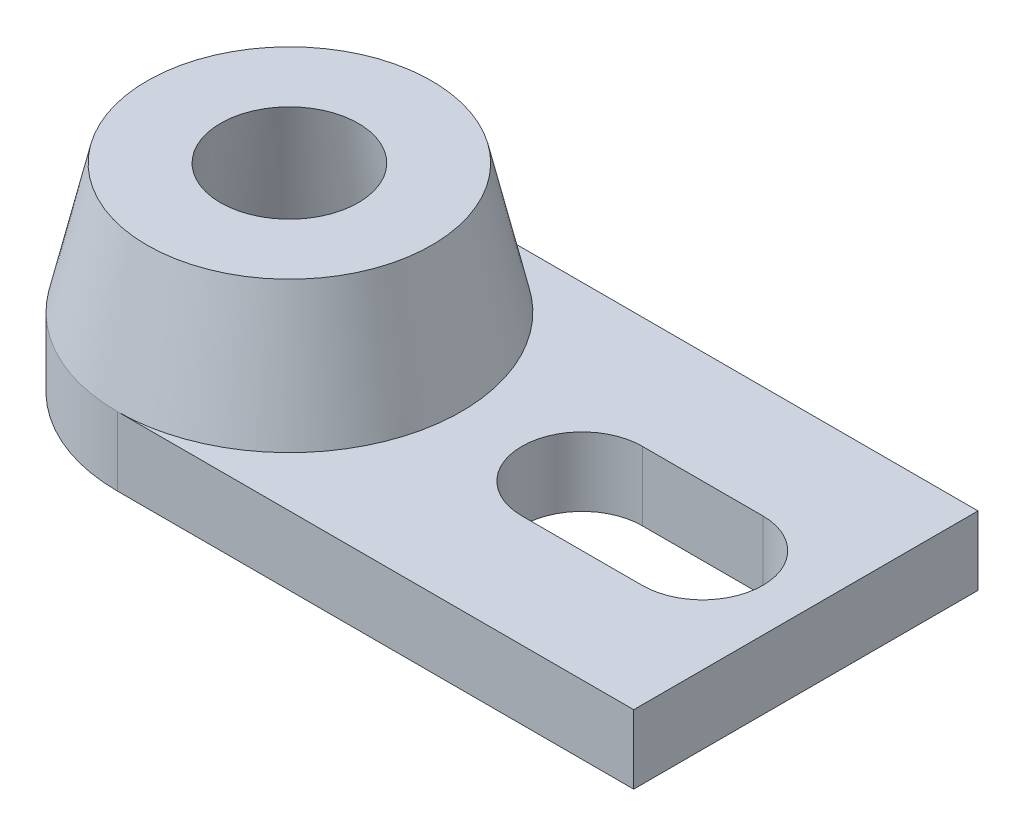
ISO-10303-21;
HEADER;
FILE_DESCRIPTION(('STEP AP214'),'2;1');
FILE_NAME('part.step','',(''),(''),'','','');
FILE_SCHEMA(('AUTOMOTIVE_DESIGN { 1 0 10303 214 1 1 1 1 }'));
ENDSEC;
DATA;
#1=APPLICATION_CONTEXT('core data for automotive mechanical design processes');
#2=APPLICATION_PROTOCOL_DEFINITION('international standard','automotive_design',2000,#1);
#3=PRODUCT_CONTEXT('',#1,'mechanical');
#4=PRODUCT('Part','Part','',(#3));
#5=PRODUCT_RELATED_PRODUCT_CATEGORY('part','',(#4));
#6=PRODUCT_DEFINITION_FORMATION('','',#4);
#7=PRODUCT_DEFINITION_CONTEXT('part definition',#1,'design');
#8=PRODUCT_DEFINITION('design','',#6,#7);
#9=PRODUCT_DEFINITION_SHAPE('','',#8);
#10=(LENGTH_UNIT() NAMED_UNIT(*) SI_UNIT(.MILLI.,.METRE.));
#11=(NAMED_UNIT(*) PLANE_ANGLE_UNIT() SI_UNIT($,.RADIAN.));
#12=(NAMED_UNIT(*) SI_UNIT($,.STERADIAN.) SOLID_ANGLE_UNIT());
#13=UNCERTAINTY_MEASURE_WITH_UNIT(LENGTH_MEASURE(1.E-05),#10,'distance_accuracy_value','');
#14=(GEOMETRIC_REPRESENTATION_CONTEXT(3) GLOBAL_UNCERTAINTY_ASSIGNED_CONTEXT((#13)) GLOBAL_UNIT_ASSIGNED_CONTEXT((#10,
#11,#12)) REPRESENTATION_CONTEXT('',''));
#15=CARTESIAN_POINT('',(0.,0.,0.));
#16=DIRECTION('',(0.,0.,1.));
#17=DIRECTION('',(1.,0.,0.));
#18=AXIS2_PLACEMENT_3D('',#15,#16,#17);
#19=CARTESIAN_POINT('',(0.,8.,0.));
#20=DIRECTION('',(0.,1.,0.));
#21=DIRECTION('',(0.,0.,1.));
#22=AXIS2_PLACEMENT_3D('',#19,#20,#21);
#23=PLANE('',#22);
#24=CARTESIAN_POINT('',(0.,8.,0.));
#25=DIRECTION('',(0.,1.,0.));
#26=DIRECTION('',(0.,0.,1.));
#27=AXIS2_PLACEMENT_3D('',#24,#25,#26);
#28=CIRCLE('',#27,20.);
#29=CARTESIAN_POINT('',(0.,8.,20.));
#30=VERTEX_POINT('',#29);
#31=CARTESIAN_POINT('',(0.,8.,-20.));
#32=VERTEX_POINT('',#31);
#33=EDGE_CURVE('E127',#30,#32,#28,.T.);
#34=ORIENTED_EDGE('',*,*,#33,.F.);
#35=DIRECTION('',(1.,0.,0.));
#36=VECTOR('',#35,1.);
#37=CARTESIAN_POINT('',(60.,8.,20.));
#38=LINE('',#37,#36);
#39=CARTESIAN_POINT('',(60.,8.,20.));
#40=VERTEX_POINT('',#39);
#41=EDGE_CURVE('E118',#30,#40,#38,.T.);
#42=ORIENTED_EDGE('',*,*,#41,.T.);
#43=DIRECTION('',(0.,0.,-1.));
#44=VECTOR('',#43,1.);
#45=CARTESIAN_POINT('',(60.,8.,-20.));
#46=LINE('',#45,#44);
#47=CARTESIAN_POINT('',(60.,8.,-20.));
#48=VERTEX_POINT('',#47);
#49=EDGE_CURVE('E125',#40,#48,#46,.T.);
#50=ORIENTED_EDGE('',*,*,#49,.T.);
#51=DIRECTION('',(-1.,0.,0.));
#52=VECTOR('',#51,1.);
#53=CARTESIAN_POINT('',(0.,8.,-20.));
#54=LINE('',#53,#52);
#55=EDGE_CURVE('E130',#48,#32,#54,.T.);
#56=ORIENTED_EDGE('',*,*,#55,.T.);
#57=EDGE_LOOP('',(#34,#42,#50,#56));
#58=FACE_BOUND('',#57,.T.);
#59=DIRECTION('',(-1.,0.,0.));
#60=VECTOR('',#59,1.);
#61=CARTESIAN_POINT('',(48.,8.,-7.));
#62=LINE('',#61,#60);
#63=CARTESIAN_POINT('',(48.,8.,-7.));
#64=VERTEX_POINT('',#63);
#65=CARTESIAN_POINT('',(34.,8.,-7.));
#66=VERTEX_POINT('',#65);
#67=EDGE_CURVE('E233',#64,#66,#62,.T.);
#68=ORIENTED_EDGE('',*,*,#67,.F.);
#69=CARTESIAN_POINT('',(48.,8.,0.));
#70=DIRECTION('',(0.,1.,0.));
#71=DIRECTION('',(0.,0.,1.));
#72=AXIS2_PLACEMENT_3D('',#69,#70,#71);
#73=CIRCLE('',#72,7.);
#74=CARTESIAN_POINT('',(48.,8.,7.));
#75=VERTEX_POINT('',#74);
#76=EDGE_CURVE('E230',#75,#64,#73,.T.);
#77=ORIENTED_EDGE('',*,*,#76,.F.);
#78=DIRECTION('',(1.,0.,0.));
#79=VECTOR('',#78,1.);
#80=CARTESIAN_POINT('',(48.,8.,7.));
#81=LINE('',#80,#79);
#82=CARTESIAN_POINT('',(34.,8.,7.));
#83=VERTEX_POINT('',#82);
#84=EDGE_CURVE('E240',#83,#75,#81,.T.);
#85=ORIENTED_EDGE('',*,*,#84,.F.);
#86=CARTESIAN_POINT('',(34.,8.,0.));
#87=DIRECTION('',(0.,1.,0.));
#88=DIRECTION('',(0.,0.,1.));
#89=AXIS2_PLACEMENT_3D('',#86,#87,#88);
#90=CIRCLE('',#89,7.);
#91=EDGE_CURVE('E237',#66,#83,#90,.T.);
#92=ORIENTED_EDGE('',*,*,#91,.F.);
#93=EDGE_LOOP('',(#68,#77,#85,#92));
#94=FACE_BOUND('',#93,.T.);
#95=ADVANCED_FACE('F41',(#58,#94),#23,.T.);
#96=CARTESIAN_POINT('',(0.,0.,0.));
#97=DIRECTION('',(0.,1.,0.));
#98=DIRECTION('',(0.,0.,1.));
#99=AXIS2_PLACEMENT_3D('',#96,#97,#98);
#100=PLANE('',#99);
#101=CARTESIAN_POINT('',(0.,0.,0.));
#102=DIRECTION('',(0.,1.,0.));
#103=DIRECTION('',(0.,0.,1.));
#104=AXIS2_PLACEMENT_3D('',#101,#102,#103);
#105=CIRCLE('',#104,12.0555205562947);
#106=CARTESIAN_POINT('',(0.,0.,12.0555205562947));
#107=VERTEX_POINT('',#106);
#108=EDGE_CURVE('E135',#107,#107,#105,.T.);
#109=ORIENTED_EDGE('',*,*,#108,.T.);
#110=EDGE_LOOP('',(#109));
#111=FACE_BOUND('',#110,.T.);
#112=CARTESIAN_POINT('',(0.,0.,0.));
#113=DIRECTION('',(0.,1.,0.));
#114=DIRECTION('',(0.,0.,1.));
#115=AXIS2_PLACEMENT_3D('',#112,#113,#114);
#116=CIRCLE('',#115,20.);
#117=CARTESIAN_POINT('',(0.,0.,-20.));
#118=VERTEX_POINT('',#117);
#119=CARTESIAN_POINT('',(0.,0.,20.));
#120=VERTEX_POINT('',#119);
#121=EDGE_CURVE('E115',#118,#120,#116,.T.);
#122=ORIENTED_EDGE('',*,*,#121,.F.);
#123=DIRECTION('',(-1.,0.,0.));
#124=VECTOR('',#123,1.);
#125=CARTESIAN_POINT('',(0.,0.,-20.));
#126=LINE('',#125,#124);
#127=CARTESIAN_POINT('',(60.,0.,-20.));
#128=VERTEX_POINT('',#127);
#129=EDGE_CURVE('E139',#128,#118,#126,.T.);
#130=ORIENTED_EDGE('',*,*,#129,.F.);
#131=DIRECTION('',(0.,0.,-1.));
#132=VECTOR('',#131,1.);
#133=CARTESIAN_POINT('',(60.,0.,-20.));
#134=LINE('',#133,#132);
#135=CARTESIAN_POINT('',(60.,0.,20.));
#136=VERTEX_POINT('',#135);
#137=EDGE_CURVE('E142',#136,#128,#134,.T.);
#138=ORIENTED_EDGE('',*,*,#137,.F.);
#139=DIRECTION('',(1.,0.,0.));
#140=VECTOR('',#139,1.);
#141=CARTESIAN_POINT('',(60.,0.,20.));
#142=LINE('',#141,#140);
#143=EDGE_CURVE('E155',#120,#136,#142,.T.);
#144=ORIENTED_EDGE('',*,*,#143,.F.);
#145=EDGE_LOOP('',(#122,#130,#138,#144));
#146=FACE_BOUND('',#145,.T.);
#147=CARTESIAN_POINT('',(48.,0.,0.));
#148=DIRECTION('',(0.,1.,0.));
#149=DIRECTION('',(0.,0.,1.));
#150=AXIS2_PLACEMENT_3D('',#147,#148,#149);
#151=CIRCLE('',#150,7.);
#152=CARTESIAN_POINT('',(48.,0.,7.));
#153=VERTEX_POINT('',#152);
#154=CARTESIAN_POINT('',(48.,0.,-7.));
#155=VERTEX_POINT('',#154);
#156=EDGE_CURVE('E65',#153,#155,#151,.T.);
#157=ORIENTED_EDGE('',*,*,#156,.T.);
#158=DIRECTION('',(-1.,0.,0.));
#159=VECTOR('',#158,1.);
#160=CARTESIAN_POINT('',(48.,0.,-7.));
#161=LINE('',#160,#159);
#162=CARTESIAN_POINT('',(34.,0.,-7.));
#163=VERTEX_POINT('',#162);
#164=EDGE_CURVE('E246',#155,#163,#161,.T.);
#165=ORIENTED_EDGE('',*,*,#164,.T.);
#166=CARTESIAN_POINT('',(34.,0.,0.));
#167=DIRECTION('',(0.,1.,0.));
#168=DIRECTION('',(0.,0.,1.));
#169=AXIS2_PLACEMENT_3D('',#166,#167,#168);
#170=CIRCLE('',#169,7.);
#171=CARTESIAN_POINT('',(34.,0.,7.));
#172=VERTEX_POINT('',#171);
#173=EDGE_CURVE('E250',#163,#172,#170,.T.);
#174=ORIENTED_EDGE('',*,*,#173,.T.);
#175=DIRECTION('',(1.,0.,0.));
#176=VECTOR('',#175,1.);
#177=CARTESIAN_POINT('',(48.,0.,7.));
#178=LINE('',#177,#176);
#179=EDGE_CURVE('E234',#172,#153,#178,.T.);
#180=ORIENTED_EDGE('',*,*,#179,.T.);
#181=EDGE_LOOP('',(#157,#165,#174,#180));
#182=FACE_BOUND('',#181,.T.);
#183=ADVANCED_FACE('F172',(#111,#146,#182),#100,.F.);
#184=CARTESIAN_POINT('',(0.,8.,0.));
#185=DIRECTION('',(0.,-1.,0.));
#186=DIRECTION('',(0.,0.,-1.));
#187=AXIS2_PLACEMENT_3D('',#184,#185,#186);
#188=CYLINDRICAL_SURFACE('',#187,20.);
#189=ORIENTED_EDGE('',*,*,#121,.T.);
#190=DIRECTION('',(0.,-1.,0.));
#191=VECTOR('',#190,1.);
#192=CARTESIAN_POINT('',(0.,8.,20.));
#193=LINE('',#192,#191);
#194=EDGE_CURVE('E11',#30,#120,#193,.T.);
#195=ORIENTED_EDGE('',*,*,#194,.F.);
#196=CARTESIAN_POINT('',(0.,8.,0.));
#197=DIRECTION('',(0.,1.,0.));
#198=DIRECTION('',(0.,0.,1.));
#199=AXIS2_PLACEMENT_3D('',#196,#197,#198);
#200=CIRCLE('',#199,20.);
#201=EDGE_CURVE('E112',#32,#30,#200,.T.);
#202=ORIENTED_EDGE('',*,*,#201,.F.);
#203=DIRECTION('',(0.,-1.,0.));
#204=VECTOR('',#203,1.);
#205=CARTESIAN_POINT('',(0.,8.,-20.));
#206=LINE('',#205,#204);
#207=EDGE_CURVE('E152',#32,#118,#206,.T.);
#208=ORIENTED_EDGE('',*,*,#207,.T.);
#209=EDGE_LOOP('',(#189,#195,#202,#208));
#210=FACE_BOUND('',#209,.T.);
#211=ADVANCED_FACE('F43',(#210),#188,.T.);
#212=CARTESIAN_POINT('',(60.,8.,20.));
#213=DIRECTION('',(0.,0.,-1.));
#214=DIRECTION('',(-1.,0.,0.));
#215=AXIS2_PLACEMENT_3D('',#212,#213,#214);
#216=PLANE('',#215);
#217=ORIENTED_EDGE('',*,*,#143,.T.);
#218=DIRECTION('',(0.,-1.,0.));
#219=VECTOR('',#218,1.);
#220=CARTESIAN_POINT('',(60.,8.,20.));
#221=LINE('',#220,#219);
#222=EDGE_CURVE('E50',#40,#136,#221,.T.);
#223=ORIENTED_EDGE('',*,*,#222,.F.);
#224=ORIENTED_EDGE('',*,*,#41,.F.);
#225=ORIENTED_EDGE('',*,*,#194,.T.);
#226=EDGE_LOOP('',(#217,#223,#224,#225));
#227=FACE_BOUND('',#226,.T.);
#228=ADVANCED_FACE('F120',(#227),#216,.F.);
#229=CARTESIAN_POINT('',(60.,8.,-20.));
#230=DIRECTION('',(-1.,0.,0.));
#231=DIRECTION('',(0.,0.,1.));
#232=AXIS2_PLACEMENT_3D('',#229,#230,#231);
#233=PLANE('',#232);
#234=ORIENTED_EDGE('',*,*,#137,.T.);
#235=DIRECTION('',(0.,-1.,0.));
#236=VECTOR('',#235,1.);
#237=CARTESIAN_POINT('',(60.,8.,-20.));
#238=LINE('',#237,#236);
#239=EDGE_CURVE('E162',#48,#128,#238,.T.);
#240=ORIENTED_EDGE('',*,*,#239,.F.);
#241=ORIENTED_EDGE('',*,*,#49,.F.);
#242=ORIENTED_EDGE('',*,*,#222,.T.);
#243=EDGE_LOOP('',(#234,#240,#241,#242));
#244=FACE_BOUND('',#243,.T.);
#245=ADVANCED_FACE('F168',(#244),#233,.F.);
#246=CARTESIAN_POINT('',(0.,8.,-20.));
#247=DIRECTION('',(0.,0.,1.));
#248=DIRECTION('',(1.,0.,0.));
#249=AXIS2_PLACEMENT_3D('',#246,#247,#248);
#250=PLANE('',#249);
#251=ORIENTED_EDGE('',*,*,#129,.T.);
#252=ORIENTED_EDGE('',*,*,#207,.F.);
#253=ORIENTED_EDGE('',*,*,#55,.F.);
#254=ORIENTED_EDGE('',*,*,#239,.T.);
#255=EDGE_LOOP('',(#251,#252,#253,#254));
#256=FACE_BOUND('',#255,.T.);
#257=ADVANCED_FACE('F175',(#256),#250,.F.);
#258=CARTESIAN_POINT('',(48.,8.,0.));
#259=DIRECTION('',(0.,-1.,0.));
#260=DIRECTION('',(0.,0.,-1.));
#261=AXIS2_PLACEMENT_3D('',#258,#259,#260);
#262=CYLINDRICAL_SURFACE('',#261,7.);
#263=ORIENTED_EDGE('',*,*,#156,.F.);
#264=DIRECTION('',(0.,-1.,0.));
#265=VECTOR('',#264,1.);
#266=CARTESIAN_POINT('',(48.,8.,7.));
#267=LINE('',#266,#265);
#268=EDGE_CURVE('E243',#75,#153,#267,.T.);
#269=ORIENTED_EDGE('',*,*,#268,.F.);
#270=ORIENTED_EDGE('',*,*,#76,.T.);
#271=DIRECTION('',(0.,-1.,0.));
#272=VECTOR('',#271,1.);
#273=CARTESIAN_POINT('',(48.,8.,-7.));
#274=LINE('',#273,#272);
#275=EDGE_CURVE('E145',#64,#155,#274,.T.);
#276=ORIENTED_EDGE('',*,*,#275,.T.);
#277=EDGE_LOOP('',(#263,#269,#270,#276));
#278=FACE_BOUND('',#277,.T.);
#279=ADVANCED_FACE('F177',(#278),#262,.F.);
#280=CARTESIAN_POINT('',(48.,8.,-7.));
#281=DIRECTION('',(0.,0.,1.));
#282=DIRECTION('',(1.,0.,0.));
#283=AXIS2_PLACEMENT_3D('',#280,#281,#282);
#284=PLANE('',#283);
#285=ORIENTED_EDGE('',*,*,#164,.F.);
#286=ORIENTED_EDGE('',*,*,#275,.F.);
#287=ORIENTED_EDGE('',*,*,#67,.T.);
#288=DIRECTION('',(0.,-1.,0.));
#289=VECTOR('',#288,1.);
#290=CARTESIAN_POINT('',(34.,8.,-7.));
#291=LINE('',#290,#289);
#292=EDGE_CURVE('E260',#66,#163,#291,.T.);
#293=ORIENTED_EDGE('',*,*,#292,.T.);
#294=EDGE_LOOP('',(#285,#286,#287,#293));
#295=FACE_BOUND('',#294,.T.);
#296=ADVANCED_FACE('F183',(#295),#284,.T.);
#297=CARTESIAN_POINT('',(34.,8.,0.));
#298=DIRECTION('',(0.,-1.,0.));
#299=DIRECTION('',(0.,0.,-1.));
#300=AXIS2_PLACEMENT_3D('',#297,#298,#299);
#301=CYLINDRICAL_SURFACE('',#300,7.);
#302=ORIENTED_EDGE('',*,*,#173,.F.);
#303=ORIENTED_EDGE('',*,*,#292,.F.);
#304=ORIENTED_EDGE('',*,*,#91,.T.);
#305=DIRECTION('',(0.,-1.,0.));
#306=VECTOR('',#305,1.);
#307=CARTESIAN_POINT('',(34.,8.,7.));
#308=LINE('',#307,#306);
#309=EDGE_CURVE('E57',#83,#172,#308,.T.);
#310=ORIENTED_EDGE('',*,*,#309,.T.);
#311=EDGE_LOOP('',(#302,#303,#304,#310));
#312=FACE_BOUND('',#311,.T.);
#313=ADVANCED_FACE('F196',(#312),#301,.F.);
#314=CARTESIAN_POINT('',(48.,8.,7.));
#315=DIRECTION('',(0.,0.,-1.));
#316=DIRECTION('',(-1.,0.,0.));
#317=AXIS2_PLACEMENT_3D('',#314,#315,#316);
#318=PLANE('',#317);
#319=ORIENTED_EDGE('',*,*,#179,.F.);
#320=ORIENTED_EDGE('',*,*,#309,.F.);
#321=ORIENTED_EDGE('',*,*,#84,.T.);
#322=ORIENTED_EDGE('',*,*,#268,.T.);
#323=EDGE_LOOP('',(#319,#320,#321,#322));
#324=FACE_BOUND('',#323,.T.);
#325=ADVANCED_FACE('F200',(#324),#318,.T.);
#326=CARTESIAN_POINT('',(0.,8.,0.));
#327=DIRECTION('',(0.,-1.,0.));
#328=DIRECTION('',(0.,0.,1.));
#329=AXIS2_PLACEMENT_3D('',#326,#327,#328);
#330=CONICAL_SURFACE('',#329,20.,0.226892802759263);
#331=CARTESIAN_POINT('',(0.,23.,0.));
#332=DIRECTION('',(0.,1.,0.));
#333=DIRECTION('',(0.,0.,1.));
#334=AXIS2_PLACEMENT_3D('',#331,#332,#333);
#335=CIRCLE('',#334,16.5369771331166);
#336=CARTESIAN_POINT('',(0.,23.,16.5369771331166));
#337=VERTEX_POINT('',#336);
#338=EDGE_CURVE('E134',#337,#337,#335,.T.);
#339=ORIENTED_EDGE('',*,*,#338,.F.);
#340=EDGE_LOOP('',(#339));
#341=FACE_BOUND('',#340,.T.);
#342=ORIENTED_EDGE('',*,*,#33,.T.);
#343=ORIENTED_EDGE('',*,*,#201,.T.);
#344=EDGE_LOOP('',(#342,#343));
#345=FACE_BOUND('',#344,.T.);
#346=ADVANCED_FACE('F137',(#341,#345),#330,.T.);
#347=CARTESIAN_POINT('',(0.,23.,0.));
#348=DIRECTION('',(0.,1.,0.));
#349=DIRECTION('',(0.,0.,1.));
#350=AXIS2_PLACEMENT_3D('',#347,#348,#349);
#351=PLANE('',#350);
#352=CARTESIAN_POINT('',(0.,23.,0.));
#353=DIRECTION('',(0.,1.,0.));
#354=DIRECTION('',(0.,0.,1.));
#355=AXIS2_PLACEMENT_3D('',#352,#353,#354);
#356=CIRCLE('',#355,8.);
#357=CARTESIAN_POINT('',(0.,23.,8.));
#358=VERTEX_POINT('',#357);
#359=EDGE_CURVE('E221',#358,#358,#356,.T.);
#360=ORIENTED_EDGE('',*,*,#359,.F.);
#361=EDGE_LOOP('',(#360));
#362=FACE_BOUND('',#361,.T.);
#363=ORIENTED_EDGE('',*,*,#338,.T.);
#364=EDGE_LOOP('',(#363));
#365=FACE_BOUND('',#364,.T.);
#366=ADVANCED_FACE('F206',(#362,#365),#351,.T.);
#367=CARTESIAN_POINT('',(0.,23.,0.));
#368=DIRECTION('',(0.,-1.,0.));
#369=DIRECTION('',(0.,0.,1.));
#370=AXIS2_PLACEMENT_3D('',#367,#368,#369);
#371=CONICAL_SURFACE('',#370,8.,0.174532925199433);
#372=ORIENTED_EDGE('',*,*,#108,.F.);
#373=EDGE_LOOP('',(#372));
#374=FACE_BOUND('',#373,.T.);
#375=ORIENTED_EDGE('',*,*,#359,.T.);
#376=EDGE_LOOP('',(#375));
#377=FACE_BOUND('',#376,.T.);
#378=ADVANCED_FACE('F210',(#374,#377),#371,.F.);
#379=CLOSED_SHELL('',(#95,#183,#211,#228,#245,#257,#279,#296,#313,#325,#346,#366,#378));
#380=MANIFOLD_SOLID_BREP('B2',#379);
#381=ADVANCED_BREP_SHAPE_REPRESENTATION('',(#18,#380),#14);
#382=SHAPE_DEFINITION_REPRESENTATION(#9,#381);
ENDSEC;
END-ISO-10303-21;
